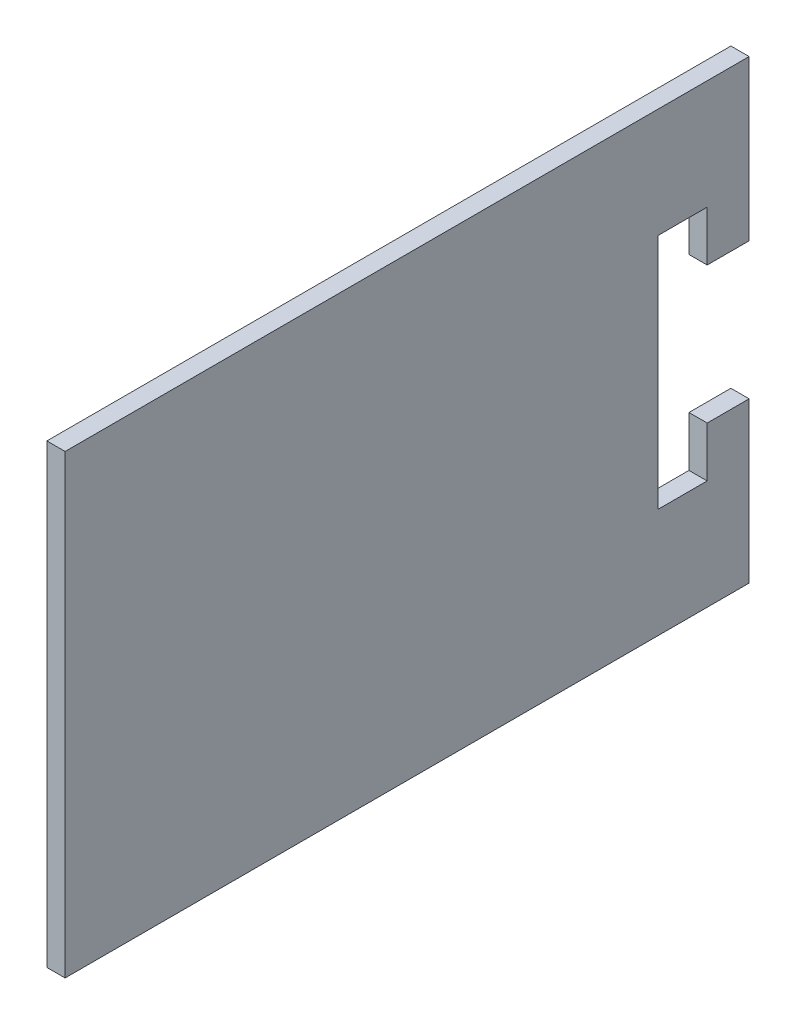
ISO-10303-21;
HEADER;
FILE_DESCRIPTION(('STEP AP214'),'2;1');
FILE_NAME('part.step','',(''),(''),'','','');
FILE_SCHEMA(('AUTOMOTIVE_DESIGN { 1 0 10303 214 1 1 1 1 }'));
ENDSEC;
DATA;
#1=APPLICATION_CONTEXT('core data for automotive mechanical design processes');
#2=APPLICATION_PROTOCOL_DEFINITION('international standard','automotive_design',2000,#1);
#3=PRODUCT_CONTEXT('',#1,'mechanical');
#4=PRODUCT('Part','Part','',(#3));
#5=PRODUCT_RELATED_PRODUCT_CATEGORY('part','',(#4));
#6=PRODUCT_DEFINITION_FORMATION('','',#4);
#7=PRODUCT_DEFINITION_CONTEXT('part definition',#1,'design');
#8=PRODUCT_DEFINITION('design','',#6,#7);
#9=PRODUCT_DEFINITION_SHAPE('','',#8);
#10=(LENGTH_UNIT() NAMED_UNIT(*) SI_UNIT(.MILLI.,.METRE.));
#11=(NAMED_UNIT(*) PLANE_ANGLE_UNIT() SI_UNIT($,.RADIAN.));
#12=(NAMED_UNIT(*) SI_UNIT($,.STERADIAN.) SOLID_ANGLE_UNIT());
#13=UNCERTAINTY_MEASURE_WITH_UNIT(LENGTH_MEASURE(1.E-05),#10,'distance_accuracy_value','');
#14=(GEOMETRIC_REPRESENTATION_CONTEXT(3) GLOBAL_UNCERTAINTY_ASSIGNED_CONTEXT((#13)) GLOBAL_UNIT_ASSIGNED_CONTEXT((#10,
#11,#12)) REPRESENTATION_CONTEXT('',''));
#15=CARTESIAN_POINT('',(0.,0.,0.));
#16=DIRECTION('',(0.,0.,1.));
#17=DIRECTION('',(1.,0.,0.));
#18=AXIS2_PLACEMENT_3D('',#15,#16,#17);
#19=CARTESIAN_POINT('',(2.54,0.,0.));
#20=DIRECTION('',(0.,0.,1.));
#21=DIRECTION('',(1.,0.,0.));
#22=AXIS2_PLACEMENT_3D('',#19,#20,#21);
#23=PLANE('',#22);
#24=DIRECTION('',(0.,1.,0.));
#25=VECTOR('',#24,1.);
#26=CARTESIAN_POINT('',(0.,0.,0.));
#27=LINE('',#26,#25);
#28=CARTESIAN_POINT('',(0.,0.,0.));
#29=VERTEX_POINT('',#28);
#30=CARTESIAN_POINT('',(0.,22.225,0.));
#31=VERTEX_POINT('',#30);
#32=EDGE_CURVE('E344',#29,#31,#27,.T.);
#33=ORIENTED_EDGE('',*,*,#32,.T.);
#34=DIRECTION('',(1.,0.,0.));
#35=VECTOR('',#34,1.);
#36=CARTESIAN_POINT('',(-11.43,22.225,0.));
#37=LINE('',#36,#35);
#38=CARTESIAN_POINT('',(2.54,22.225,0.));
#39=VERTEX_POINT('',#38);
#40=EDGE_CURVE('E297',#31,#39,#37,.T.);
#41=ORIENTED_EDGE('',*,*,#40,.T.);
#42=DIRECTION('',(0.,1.,0.));
#43=VECTOR('',#42,1.);
#44=CARTESIAN_POINT('',(2.54,0.,0.));
#45=LINE('',#44,#43);
#46=CARTESIAN_POINT('',(2.54,0.,0.));
#47=VERTEX_POINT('',#46);
#48=EDGE_CURVE('E329',#47,#39,#45,.T.);
#49=ORIENTED_EDGE('',*,*,#48,.F.);
#50=DIRECTION('',(-1.,0.,0.));
#51=VECTOR('',#50,1.);
#52=CARTESIAN_POINT('',(2.54,0.,0.));
#53=LINE('',#52,#51);
#54=EDGE_CURVE('E364',#47,#29,#53,.T.);
#55=ORIENTED_EDGE('',*,*,#54,.T.);
#56=EDGE_LOOP('',(#33,#41,#49,#55));
#57=FACE_BOUND('',#56,.T.);
#58=ADVANCED_FACE('F45',(#57),#23,.F.);
#59=CARTESIAN_POINT('',(2.54,0.,0.));
#60=DIRECTION('',(0.,1.,0.));
#61=DIRECTION('',(0.,0.,1.));
#62=AXIS2_PLACEMENT_3D('',#59,#60,#61);
#63=PLANE('',#62);
#64=DIRECTION('',(0.,0.,-1.));
#65=VECTOR('',#64,1.);
#66=CARTESIAN_POINT('',(0.,0.,0.));
#67=LINE('',#66,#65);
#68=CARTESIAN_POINT('',(0.,0.,95.25));
#69=VERTEX_POINT('',#68);
#70=EDGE_CURVE('E301',#69,#29,#67,.T.);
#71=ORIENTED_EDGE('',*,*,#70,.T.);
#72=ORIENTED_EDGE('',*,*,#54,.F.);
#73=DIRECTION('',(0.,0.,-1.));
#74=VECTOR('',#73,1.);
#75=CARTESIAN_POINT('',(2.54,0.,0.));
#76=LINE('',#75,#74);
#77=CARTESIAN_POINT('',(2.54,0.,95.25));
#78=VERTEX_POINT('',#77);
#79=EDGE_CURVE('E323',#78,#47,#76,.T.);
#80=ORIENTED_EDGE('',*,*,#79,.F.);
#81=DIRECTION('',(-1.,0.,0.));
#82=VECTOR('',#81,1.);
#83=CARTESIAN_POINT('',(2.54,0.,95.25));
#84=LINE('',#83,#82);
#85=EDGE_CURVE('E339',#78,#69,#84,.T.);
#86=ORIENTED_EDGE('',*,*,#85,.T.);
#87=EDGE_LOOP('',(#71,#72,#80,#86));
#88=FACE_BOUND('',#87,.T.);
#89=ADVANCED_FACE('F47',(#88),#63,.F.);
#90=CARTESIAN_POINT('',(2.54,41.275,0.));
#91=VERTEX_POINT('',#90);
#92=CARTESIAN_POINT('',(2.54,63.5,0.));
#93=VERTEX_POINT('',#92);
#94=EDGE_CURVE('E327',#91,#93,#45,.T.);
#95=ORIENTED_EDGE('',*,*,#94,.F.);
#96=DIRECTION('',(1.,0.,0.));
#97=VECTOR('',#96,1.);
#98=CARTESIAN_POINT('',(-11.43,41.275,0.));
#99=LINE('',#98,#97);
#100=CARTESIAN_POINT('',(0.,41.275,0.));
#101=VERTEX_POINT('',#100);
#102=EDGE_CURVE('E317',#101,#91,#99,.T.);
#103=ORIENTED_EDGE('',*,*,#102,.F.);
#104=CARTESIAN_POINT('',(0.,63.5,0.));
#105=VERTEX_POINT('',#104);
#106=EDGE_CURVE('E343',#101,#105,#27,.T.);
#107=ORIENTED_EDGE('',*,*,#106,.T.);
#108=DIRECTION('',(-1.,0.,0.));
#109=VECTOR('',#108,1.);
#110=CARTESIAN_POINT('',(2.54,63.5,0.));
#111=LINE('',#110,#109);
#112=EDGE_CURVE('E360',#93,#105,#111,.T.);
#113=ORIENTED_EDGE('',*,*,#112,.F.);
#114=EDGE_LOOP('',(#95,#103,#107,#113));
#115=FACE_BOUND('',#114,.T.);
#116=ADVANCED_FACE('F428',(#115),#23,.F.);
#117=CARTESIAN_POINT('',(2.54,63.5,0.));
#118=DIRECTION('',(0.,-1.,0.));
#119=DIRECTION('',(0.,0.,-1.));
#120=AXIS2_PLACEMENT_3D('',#117,#118,#119);
#121=PLANE('',#120);
#122=DIRECTION('',(0.,0.,1.));
#123=VECTOR('',#122,1.);
#124=CARTESIAN_POINT('',(0.,63.5,0.));
#125=LINE('',#124,#123);
#126=CARTESIAN_POINT('',(0.,63.5,95.25));
#127=VERTEX_POINT('',#126);
#128=EDGE_CURVE('E348',#105,#127,#125,.T.);
#129=ORIENTED_EDGE('',*,*,#128,.T.);
#130=DIRECTION('',(-1.,0.,0.));
#131=VECTOR('',#130,1.);
#132=CARTESIAN_POINT('',(2.54,63.5,95.25));
#133=LINE('',#132,#131);
#134=CARTESIAN_POINT('',(2.54,63.5,95.25));
#135=VERTEX_POINT('',#134);
#136=EDGE_CURVE('E356',#135,#127,#133,.T.);
#137=ORIENTED_EDGE('',*,*,#136,.F.);
#138=DIRECTION('',(0.,0.,1.));
#139=VECTOR('',#138,1.);
#140=CARTESIAN_POINT('',(2.54,63.5,0.));
#141=LINE('',#140,#139);
#142=EDGE_CURVE('E333',#93,#135,#141,.T.);
#143=ORIENTED_EDGE('',*,*,#142,.F.);
#144=ORIENTED_EDGE('',*,*,#112,.T.);
#145=EDGE_LOOP('',(#129,#137,#143,#144));
#146=FACE_BOUND('',#145,.T.);
#147=ADVANCED_FACE('F436',(#146),#121,.F.);
#148=CARTESIAN_POINT('',(2.54,0.,95.25));
#149=DIRECTION('',(0.,0.,-1.));
#150=DIRECTION('',(-1.,0.,0.));
#151=AXIS2_PLACEMENT_3D('',#148,#149,#150);
#152=PLANE('',#151);
#153=DIRECTION('',(0.,-1.,0.));
#154=VECTOR('',#153,1.);
#155=CARTESIAN_POINT('',(0.,0.,95.25));
#156=LINE('',#155,#154);
#157=EDGE_CURVE('E328',#127,#69,#156,.T.);
#158=ORIENTED_EDGE('',*,*,#157,.T.);
#159=ORIENTED_EDGE('',*,*,#85,.F.);
#160=DIRECTION('',(0.,-1.,0.));
#161=VECTOR('',#160,1.);
#162=CARTESIAN_POINT('',(2.54,0.,95.25));
#163=LINE('',#162,#161);
#164=EDGE_CURVE('E336',#135,#78,#163,.T.);
#165=ORIENTED_EDGE('',*,*,#164,.F.);
#166=ORIENTED_EDGE('',*,*,#136,.T.);
#167=EDGE_LOOP('',(#158,#159,#165,#166));
#168=FACE_BOUND('',#167,.T.);
#169=ADVANCED_FACE('F442',(#168),#152,.F.);
#170=CARTESIAN_POINT('',(2.54,0.,0.));
#171=DIRECTION('',(-1.,0.,0.));
#172=DIRECTION('',(0.,0.,1.));
#173=AXIS2_PLACEMENT_3D('',#170,#171,#172);
#174=PLANE('',#173);
#175=ORIENTED_EDGE('',*,*,#48,.T.);
#176=DIRECTION('',(0.,0.,-1.));
#177=VECTOR('',#176,1.);
#178=CARTESIAN_POINT('',(2.54,22.225,0.));
#179=LINE('',#178,#177);
#180=CARTESIAN_POINT('',(2.54,22.225,5.842));
#181=VERTEX_POINT('',#180);
#182=EDGE_CURVE('E270',#181,#39,#179,.T.);
#183=ORIENTED_EDGE('',*,*,#182,.F.);
#184=DIRECTION('',(0.,1.,0.));
#185=VECTOR('',#184,1.);
#186=CARTESIAN_POINT('',(2.54,22.225,5.842));
#187=LINE('',#186,#185);
#188=CARTESIAN_POINT('',(2.54,15.24,5.842));
#189=VERTEX_POINT('',#188);
#190=EDGE_CURVE('E293',#189,#181,#187,.T.);
#191=ORIENTED_EDGE('',*,*,#190,.F.);
#192=DIRECTION('',(0.,0.,-1.));
#193=VECTOR('',#192,1.);
#194=CARTESIAN_POINT('',(2.54,15.24,12.7));
#195=LINE('',#194,#193);
#196=CARTESIAN_POINT('',(2.54,15.24,12.7));
#197=VERTEX_POINT('',#196);
#198=EDGE_CURVE('E289',#197,#189,#195,.T.);
#199=ORIENTED_EDGE('',*,*,#198,.F.);
#200=DIRECTION('',(0.,-1.,0.));
#201=VECTOR('',#200,1.);
#202=CARTESIAN_POINT('',(2.54,22.098,12.7));
#203=LINE('',#202,#201);
#204=CARTESIAN_POINT('',(2.54,48.26,12.7));
#205=VERTEX_POINT('',#204);
#206=EDGE_CURVE('E285',#205,#197,#203,.T.);
#207=ORIENTED_EDGE('',*,*,#206,.F.);
#208=DIRECTION('',(0.,0.,1.));
#209=VECTOR('',#208,1.);
#210=CARTESIAN_POINT('',(2.54,48.26,12.7));
#211=LINE('',#210,#209);
#212=CARTESIAN_POINT('',(2.54,48.26,5.842));
#213=VERTEX_POINT('',#212);
#214=EDGE_CURVE('E281',#213,#205,#211,.T.);
#215=ORIENTED_EDGE('',*,*,#214,.F.);
#216=DIRECTION('',(0.,1.,0.));
#217=VECTOR('',#216,1.);
#218=CARTESIAN_POINT('',(2.54,41.275,5.842));
#219=LINE('',#218,#217);
#220=CARTESIAN_POINT('',(2.54,41.275,5.842));
#221=VERTEX_POINT('',#220);
#222=EDGE_CURVE('E277',#221,#213,#219,.T.);
#223=ORIENTED_EDGE('',*,*,#222,.F.);
#224=DIRECTION('',(0.,0.,1.));
#225=VECTOR('',#224,1.);
#226=CARTESIAN_POINT('',(2.54,41.275,0.));
#227=LINE('',#226,#225);
#228=EDGE_CURVE('E273',#91,#221,#227,.T.);
#229=ORIENTED_EDGE('',*,*,#228,.F.);
#230=ORIENTED_EDGE('',*,*,#94,.T.);
#231=ORIENTED_EDGE('',*,*,#142,.T.);
#232=ORIENTED_EDGE('',*,*,#164,.T.);
#233=ORIENTED_EDGE('',*,*,#79,.T.);
#234=EDGE_LOOP('',(#175,#183,#191,#199,#207,#215,#223,#229,#230,#231,#232,#233));
#235=FACE_BOUND('',#234,.T.);
#236=ADVANCED_FACE('F463',(#235),#174,.F.);
#237=CARTESIAN_POINT('',(0.,0.,0.));
#238=DIRECTION('',(-1.,0.,0.));
#239=DIRECTION('',(0.,0.,1.));
#240=AXIS2_PLACEMENT_3D('',#237,#238,#239);
#241=PLANE('',#240);
#242=DIRECTION('',(0.,0.,-1.));
#243=VECTOR('',#242,1.);
#244=CARTESIAN_POINT('',(0.,40.64,12.7));
#245=LINE('',#244,#243);
#246=CARTESIAN_POINT('',(0.,40.64,27.94));
#247=VERTEX_POINT('',#246);
#248=CARTESIAN_POINT('',(0.,40.64,12.7));
#249=VERTEX_POINT('',#248);
#250=EDGE_CURVE('E69',#247,#249,#245,.T.);
#251=ORIENTED_EDGE('',*,*,#250,.F.);
#252=DIRECTION('',(0.,1.,0.));
#253=VECTOR('',#252,1.);
#254=CARTESIAN_POINT('',(0.,40.64,27.94));
#255=LINE('',#254,#253);
#256=CARTESIAN_POINT('',(0.,25.4,27.94));
#257=VERTEX_POINT('',#256);
#258=EDGE_CURVE('E237',#257,#247,#255,.T.);
#259=ORIENTED_EDGE('',*,*,#258,.F.);
#260=DIRECTION('',(0.,0.,1.));
#261=VECTOR('',#260,1.);
#262=CARTESIAN_POINT('',(0.,25.4,12.7));
#263=LINE('',#262,#261);
#264=CARTESIAN_POINT('',(0.,25.4,12.7));
#265=VERTEX_POINT('',#264);
#266=EDGE_CURVE('E249',#265,#257,#263,.T.);
#267=ORIENTED_EDGE('',*,*,#266,.F.);
#268=DIRECTION('',(0.,1.,0.));
#269=VECTOR('',#268,1.);
#270=CARTESIAN_POINT('',(0.,0.,12.7));
#271=LINE('',#270,#269);
#272=CARTESIAN_POINT('',(0.,15.24,12.7));
#273=VERTEX_POINT('',#272);
#274=EDGE_CURVE('E379',#273,#265,#271,.T.);
#275=ORIENTED_EDGE('',*,*,#274,.F.);
#276=DIRECTION('',(0.,0.,1.));
#277=VECTOR('',#276,1.);
#278=CARTESIAN_POINT('',(0.,15.24,0.));
#279=LINE('',#278,#277);
#280=CARTESIAN_POINT('',(0.,15.24,5.842));
#281=VERTEX_POINT('',#280);
#282=EDGE_CURVE('E383',#281,#273,#279,.T.);
#283=ORIENTED_EDGE('',*,*,#282,.F.);
#284=DIRECTION('',(0.,-1.,0.));
#285=VECTOR('',#284,1.);
#286=CARTESIAN_POINT('',(0.,0.,5.842));
#287=LINE('',#286,#285);
#288=CARTESIAN_POINT('',(0.,22.225,5.842));
#289=VERTEX_POINT('',#288);
#290=EDGE_CURVE('E54',#289,#281,#287,.T.);
#291=ORIENTED_EDGE('',*,*,#290,.F.);
#292=DIRECTION('',(0.,0.,1.));
#293=VECTOR('',#292,1.);
#294=CARTESIAN_POINT('',(0.,22.225,0.));
#295=LINE('',#294,#293);
#296=EDGE_CURVE('E11',#31,#289,#295,.T.);
#297=ORIENTED_EDGE('',*,*,#296,.F.);
#298=ORIENTED_EDGE('',*,*,#32,.F.);
#299=ORIENTED_EDGE('',*,*,#70,.F.);
#300=ORIENTED_EDGE('',*,*,#157,.F.);
#301=ORIENTED_EDGE('',*,*,#128,.F.);
#302=ORIENTED_EDGE('',*,*,#106,.F.);
#303=DIRECTION('',(0.,0.,-1.));
#304=VECTOR('',#303,1.);
#305=CARTESIAN_POINT('',(0.,41.275,0.));
#306=LINE('',#305,#304);
#307=CARTESIAN_POINT('',(0.,41.275,5.842));
#308=VERTEX_POINT('',#307);
#309=EDGE_CURVE('E368',#308,#101,#306,.T.);
#310=ORIENTED_EDGE('',*,*,#309,.F.);
#311=DIRECTION('',(0.,-1.,0.));
#312=VECTOR('',#311,1.);
#313=CARTESIAN_POINT('',(0.,0.,5.84199999999998));
#314=LINE('',#313,#312);
#315=CARTESIAN_POINT('',(0.,48.26,5.842));
#316=VERTEX_POINT('',#315);
#317=EDGE_CURVE('E371',#316,#308,#314,.T.);
#318=ORIENTED_EDGE('',*,*,#317,.F.);
#319=DIRECTION('',(0.,0.,-1.));
#320=VECTOR('',#319,1.);
#321=CARTESIAN_POINT('',(0.,48.26,0.));
#322=LINE('',#321,#320);
#323=CARTESIAN_POINT('',(0.,48.26,12.7));
#324=VERTEX_POINT('',#323);
#325=EDGE_CURVE('E375',#324,#316,#322,.T.);
#326=ORIENTED_EDGE('',*,*,#325,.F.);
#327=EDGE_CURVE('E378',#249,#324,#271,.T.);
#328=ORIENTED_EDGE('',*,*,#327,.F.);
#329=EDGE_LOOP('',(#251,#259,#267,#275,#283,#291,#297,#298,#299,#300,#301,#302,#310,#318,#326,#328));
#330=FACE_BOUND('',#329,.T.);
#331=ADVANCED_FACE('F399',(#330),#241,.T.);
#332=CARTESIAN_POINT('',(-11.43,22.225,0.));
#333=DIRECTION('',(0.,-1.,0.));
#334=DIRECTION('',(0.,0.,-1.));
#335=AXIS2_PLACEMENT_3D('',#332,#333,#334);
#336=PLANE('',#335);
#337=ORIENTED_EDGE('',*,*,#296,.T.);
#338=DIRECTION('',(1.,0.,0.));
#339=VECTOR('',#338,1.);
#340=CARTESIAN_POINT('',(-11.43,22.225,5.842));
#341=LINE('',#340,#339);
#342=EDGE_CURVE('E298',#289,#181,#341,.T.);
#343=ORIENTED_EDGE('',*,*,#342,.T.);
#344=ORIENTED_EDGE('',*,*,#182,.T.);
#345=ORIENTED_EDGE('',*,*,#40,.F.);
#346=EDGE_LOOP('',(#337,#343,#344,#345));
#347=FACE_BOUND('',#346,.T.);
#348=ADVANCED_FACE('F466',(#347),#336,.F.);
#349=CARTESIAN_POINT('',(-11.43,22.225,5.842));
#350=DIRECTION('',(0.,0.,-1.));
#351=DIRECTION('',(0.,1.,0.));
#352=AXIS2_PLACEMENT_3D('',#349,#350,#351);
#353=PLANE('',#352);
#354=ORIENTED_EDGE('',*,*,#290,.T.);
#355=DIRECTION('',(1.,0.,0.));
#356=VECTOR('',#355,1.);
#357=CARTESIAN_POINT('',(-11.43,15.24,5.842));
#358=LINE('',#357,#356);
#359=EDGE_CURVE('E302',#281,#189,#358,.T.);
#360=ORIENTED_EDGE('',*,*,#359,.T.);
#361=ORIENTED_EDGE('',*,*,#190,.T.);
#362=ORIENTED_EDGE('',*,*,#342,.F.);
#363=EDGE_LOOP('',(#354,#360,#361,#362));
#364=FACE_BOUND('',#363,.T.);
#365=ADVANCED_FACE('F390',(#364),#353,.F.);
#366=CARTESIAN_POINT('',(-11.43,15.24,12.7));
#367=DIRECTION('',(0.,-1.,0.));
#368=DIRECTION('',(0.,0.,-1.));
#369=AXIS2_PLACEMENT_3D('',#366,#367,#368);
#370=PLANE('',#369);
#371=ORIENTED_EDGE('',*,*,#282,.T.);
#372=DIRECTION('',(1.,0.,0.));
#373=VECTOR('',#372,1.);
#374=CARTESIAN_POINT('',(-11.43,15.24,12.7));
#375=LINE('',#374,#373);
#376=EDGE_CURVE('E305',#273,#197,#375,.T.);
#377=ORIENTED_EDGE('',*,*,#376,.T.);
#378=ORIENTED_EDGE('',*,*,#198,.T.);
#379=ORIENTED_EDGE('',*,*,#359,.F.);
#380=EDGE_LOOP('',(#371,#377,#378,#379));
#381=FACE_BOUND('',#380,.T.);
#382=ADVANCED_FACE('F394',(#381),#370,.F.);
#383=CARTESIAN_POINT('',(-11.43,22.098,12.7));
#384=DIRECTION('',(0.,0.,1.));
#385=DIRECTION('',(0.,-1.,0.));
#386=AXIS2_PLACEMENT_3D('',#383,#384,#385);
#387=PLANE('',#386);
#388=DIRECTION('',(1.,0.,0.));
#389=VECTOR('',#388,1.);
#390=CARTESIAN_POINT('',(-12.7,38.1,12.7));
#391=LINE('',#390,#389);
#392=CARTESIAN_POINT('',(-12.7,38.1,12.7));
#393=VERTEX_POINT('',#392);
#394=CARTESIAN_POINT('',(0.,38.1,12.7));
#395=VERTEX_POINT('',#394);
#396=EDGE_CURVE('E218',#393,#395,#391,.T.);
#397=ORIENTED_EDGE('',*,*,#396,.F.);
#398=DIRECTION('',(0.,1.,0.));
#399=VECTOR('',#398,1.);
#400=CARTESIAN_POINT('',(-12.7,38.1,12.7));
#401=LINE('',#400,#399);
#402=CARTESIAN_POINT('',(-12.7,27.94,12.7));
#403=VERTEX_POINT('',#402);
#404=EDGE_CURVE('E61',#403,#393,#401,.T.);
#405=ORIENTED_EDGE('',*,*,#404,.F.);
#406=DIRECTION('',(-1.,0.,0.));
#407=VECTOR('',#406,1.);
#408=CARTESIAN_POINT('',(-12.7,27.94,12.7));
#409=LINE('',#408,#407);
#410=CARTESIAN_POINT('',(0.,27.94,12.7));
#411=VERTEX_POINT('',#410);
#412=EDGE_CURVE('E205',#411,#403,#409,.T.);
#413=ORIENTED_EDGE('',*,*,#412,.F.);
#414=DIRECTION('',(0.,-1.,0.));
#415=VECTOR('',#414,1.);
#416=CARTESIAN_POINT('',(0.,38.1,12.7));
#417=LINE('',#416,#415);
#418=EDGE_CURVE('E209',#395,#411,#417,.T.);
#419=ORIENTED_EDGE('',*,*,#418,.F.);
#420=EDGE_LOOP('',(#397,#405,#413,#419));
#421=FACE_BOUND('',#420,.T.);
#422=ORIENTED_EDGE('',*,*,#274,.T.);
#423=DIRECTION('',(1.,0.,0.));
#424=VECTOR('',#423,1.);
#425=CARTESIAN_POINT('',(-15.24,25.4,12.7));
#426=LINE('',#425,#424);
#427=CARTESIAN_POINT('',(-15.24,25.4,12.7));
#428=VERTEX_POINT('',#427);
#429=EDGE_CURVE('E262',#428,#265,#426,.T.);
#430=ORIENTED_EDGE('',*,*,#429,.F.);
#431=DIRECTION('',(0.,-1.,0.));
#432=VECTOR('',#431,1.);
#433=CARTESIAN_POINT('',(-15.24,40.64,12.7));
#434=LINE('',#433,#432);
#435=CARTESIAN_POINT('',(-15.24,40.64,12.7));
#436=VERTEX_POINT('',#435);
#437=EDGE_CURVE('E236',#436,#428,#434,.T.);
#438=ORIENTED_EDGE('',*,*,#437,.F.);
#439=DIRECTION('',(1.,0.,0.));
#440=VECTOR('',#439,1.);
#441=CARTESIAN_POINT('',(-15.24,40.64,12.7));
#442=LINE('',#441,#440);
#443=EDGE_CURVE('E266',#436,#249,#442,.T.);
#444=ORIENTED_EDGE('',*,*,#443,.T.);
#445=ORIENTED_EDGE('',*,*,#327,.T.);
#446=DIRECTION('',(1.,0.,0.));
#447=VECTOR('',#446,1.);
#448=CARTESIAN_POINT('',(-11.43,48.26,12.7));
#449=LINE('',#448,#447);
#450=EDGE_CURVE('E308',#324,#205,#449,.T.);
#451=ORIENTED_EDGE('',*,*,#450,.T.);
#452=ORIENTED_EDGE('',*,*,#206,.T.);
#453=ORIENTED_EDGE('',*,*,#376,.F.);
#454=EDGE_LOOP('',(#422,#430,#438,#444,#445,#451,#452,#453));
#455=FACE_BOUND('',#454,.T.);
#456=ADVANCED_FACE('F402',(#421,#455),#387,.F.);
#457=CARTESIAN_POINT('',(-11.43,48.26,12.7));
#458=DIRECTION('',(0.,1.,0.));
#459=DIRECTION('',(0.,0.,1.));
#460=AXIS2_PLACEMENT_3D('',#457,#458,#459);
#461=PLANE('',#460);
#462=ORIENTED_EDGE('',*,*,#325,.T.);
#463=DIRECTION('',(1.,0.,0.));
#464=VECTOR('',#463,1.);
#465=CARTESIAN_POINT('',(-11.43,48.26,5.842));
#466=LINE('',#465,#464);
#467=EDGE_CURVE('E311',#316,#213,#466,.T.);
#468=ORIENTED_EDGE('',*,*,#467,.T.);
#469=ORIENTED_EDGE('',*,*,#214,.T.);
#470=ORIENTED_EDGE('',*,*,#450,.F.);
#471=EDGE_LOOP('',(#462,#468,#469,#470));
#472=FACE_BOUND('',#471,.T.);
#473=ADVANCED_FACE('F472',(#472),#461,.F.);
#474=CARTESIAN_POINT('',(-11.43,41.275,5.842));
#475=DIRECTION('',(0.,0.,-1.));
#476=DIRECTION('',(0.,1.,0.));
#477=AXIS2_PLACEMENT_3D('',#474,#475,#476);
#478=PLANE('',#477);
#479=ORIENTED_EDGE('',*,*,#317,.T.);
#480=DIRECTION('',(1.,0.,0.));
#481=VECTOR('',#480,1.);
#482=CARTESIAN_POINT('',(-11.43,41.275,5.842));
#483=LINE('',#482,#481);
#484=EDGE_CURVE('E314',#308,#221,#483,.T.);
#485=ORIENTED_EDGE('',*,*,#484,.T.);
#486=ORIENTED_EDGE('',*,*,#222,.T.);
#487=ORIENTED_EDGE('',*,*,#467,.F.);
#488=EDGE_LOOP('',(#479,#485,#486,#487));
#489=FACE_BOUND('',#488,.T.);
#490=ADVANCED_FACE('F476',(#489),#478,.F.);
#491=CARTESIAN_POINT('',(-11.43,41.275,0.));
#492=DIRECTION('',(0.,1.,0.));
#493=DIRECTION('',(0.,0.,1.));
#494=AXIS2_PLACEMENT_3D('',#491,#492,#493);
#495=PLANE('',#494);
#496=ORIENTED_EDGE('',*,*,#309,.T.);
#497=ORIENTED_EDGE('',*,*,#102,.T.);
#498=ORIENTED_EDGE('',*,*,#228,.T.);
#499=ORIENTED_EDGE('',*,*,#484,.F.);
#500=EDGE_LOOP('',(#496,#497,#498,#499));
#501=FACE_BOUND('',#500,.T.);
#502=ADVANCED_FACE('F478',(#501),#495,.F.);
#503=CARTESIAN_POINT('',(-15.24,40.64,12.7));
#504=DIRECTION('',(0.,-1.,0.));
#505=DIRECTION('',(0.,0.,-1.));
#506=AXIS2_PLACEMENT_3D('',#503,#504,#505);
#507=PLANE('',#506);
#508=ORIENTED_EDGE('',*,*,#250,.T.);
#509=ORIENTED_EDGE('',*,*,#443,.F.);
#510=DIRECTION('',(0.,0.,-1.));
#511=VECTOR('',#510,1.);
#512=CARTESIAN_POINT('',(-15.24,40.64,12.7));
#513=LINE('',#512,#511);
#514=CARTESIAN_POINT('',(-15.24,40.64,27.94));
#515=VERTEX_POINT('',#514);
#516=EDGE_CURVE('E232',#515,#436,#513,.T.);
#517=ORIENTED_EDGE('',*,*,#516,.F.);
#518=DIRECTION('',(1.,0.,0.));
#519=VECTOR('',#518,1.);
#520=CARTESIAN_POINT('',(-15.24,40.64,27.94));
#521=LINE('',#520,#519);
#522=EDGE_CURVE('E246',#515,#247,#521,.T.);
#523=ORIENTED_EDGE('',*,*,#522,.T.);
#524=EDGE_LOOP('',(#508,#509,#517,#523));
#525=FACE_BOUND('',#524,.T.);
#526=ADVANCED_FACE('F415',(#525),#507,.F.);
#527=CARTESIAN_POINT('',(-15.24,25.4,12.7));
#528=DIRECTION('',(0.,1.,0.));
#529=DIRECTION('',(0.,0.,1.));
#530=AXIS2_PLACEMENT_3D('',#527,#528,#529);
#531=PLANE('',#530);
#532=ORIENTED_EDGE('',*,*,#266,.T.);
#533=DIRECTION('',(1.,0.,0.));
#534=VECTOR('',#533,1.);
#535=CARTESIAN_POINT('',(-15.24,25.4,27.94));
#536=LINE('',#535,#534);
#537=CARTESIAN_POINT('',(-15.24,25.4,27.94));
#538=VERTEX_POINT('',#537);
#539=EDGE_CURVE('E258',#538,#257,#536,.T.);
#540=ORIENTED_EDGE('',*,*,#539,.F.);
#541=DIRECTION('',(0.,0.,1.));
#542=VECTOR('',#541,1.);
#543=CARTESIAN_POINT('',(-15.24,25.4,12.7));
#544=LINE('',#543,#542);
#545=EDGE_CURVE('E240',#428,#538,#544,.T.);
#546=ORIENTED_EDGE('',*,*,#545,.F.);
#547=ORIENTED_EDGE('',*,*,#429,.T.);
#548=EDGE_LOOP('',(#532,#540,#546,#547));
#549=FACE_BOUND('',#548,.T.);
#550=ADVANCED_FACE('F405',(#549),#531,.F.);
#551=CARTESIAN_POINT('',(-15.24,40.64,27.94));
#552=DIRECTION('',(0.,0.,-1.));
#553=DIRECTION('',(-1.,0.,0.));
#554=AXIS2_PLACEMENT_3D('',#551,#552,#553);
#555=PLANE('',#554);
#556=ORIENTED_EDGE('',*,*,#258,.T.);
#557=ORIENTED_EDGE('',*,*,#522,.F.);
#558=DIRECTION('',(0.,1.,0.));
#559=VECTOR('',#558,1.);
#560=CARTESIAN_POINT('',(-15.24,40.64,27.94));
#561=LINE('',#560,#559);
#562=EDGE_CURVE('E243',#538,#515,#561,.T.);
#563=ORIENTED_EDGE('',*,*,#562,.F.);
#564=ORIENTED_EDGE('',*,*,#539,.T.);
#565=EDGE_LOOP('',(#556,#557,#563,#564));
#566=FACE_BOUND('',#565,.T.);
#567=ADVANCED_FACE('F417',(#566),#555,.F.);
#568=CARTESIAN_POINT('',(-15.24,0.,0.));
#569=DIRECTION('',(1.,0.,0.));
#570=DIRECTION('',(0.,0.,-1.));
#571=AXIS2_PLACEMENT_3D('',#568,#569,#570);
#572=PLANE('',#571);
#573=ORIENTED_EDGE('',*,*,#516,.T.);
#574=ORIENTED_EDGE('',*,*,#437,.T.);
#575=ORIENTED_EDGE('',*,*,#545,.T.);
#576=ORIENTED_EDGE('',*,*,#562,.T.);
#577=EDGE_LOOP('',(#573,#574,#575,#576));
#578=FACE_BOUND('',#577,.T.);
#579=ADVANCED_FACE('F409',(#578),#572,.F.);
#580=CARTESIAN_POINT('',(-12.7,38.1,25.4));
#581=DIRECTION('',(-1.,0.,0.));
#582=DIRECTION('',(0.,0.,1.));
#583=AXIS2_PLACEMENT_3D('',#580,#581,#582);
#584=PLANE('',#583);
#585=ORIENTED_EDGE('',*,*,#404,.T.);
#586=DIRECTION('',(0.,0.,-1.));
#587=VECTOR('',#586,1.);
#588=CARTESIAN_POINT('',(-12.7,38.1,25.4));
#589=LINE('',#588,#587);
#590=CARTESIAN_POINT('',(-12.7,38.1,25.4));
#591=VERTEX_POINT('',#590);
#592=EDGE_CURVE('E180',#591,#393,#589,.T.);
#593=ORIENTED_EDGE('',*,*,#592,.F.);
#594=DIRECTION('',(0.,1.,0.));
#595=VECTOR('',#594,1.);
#596=CARTESIAN_POINT('',(-12.7,38.1,25.4));
#597=LINE('',#596,#595);
#598=CARTESIAN_POINT('',(-12.7,27.94,25.4));
#599=VERTEX_POINT('',#598);
#600=EDGE_CURVE('E184',#599,#591,#597,.T.);
#601=ORIENTED_EDGE('',*,*,#600,.F.);
#602=DIRECTION('',(0.,0.,-1.));
#603=VECTOR('',#602,1.);
#604=CARTESIAN_POINT('',(-12.7,27.94,25.4));
#605=LINE('',#604,#603);
#606=EDGE_CURVE('E224',#599,#403,#605,.T.);
#607=ORIENTED_EDGE('',*,*,#606,.T.);
#608=EDGE_LOOP('',(#585,#593,#601,#607));
#609=FACE_BOUND('',#608,.T.);
#610=ADVANCED_FACE('F182',(#609),#584,.F.);
#611=CARTESIAN_POINT('',(-12.7,27.94,25.4));
#612=DIRECTION('',(0.,-1.,0.));
#613=DIRECTION('',(0.,0.,-1.));
#614=AXIS2_PLACEMENT_3D('',#611,#612,#613);
#615=PLANE('',#614);
#616=ORIENTED_EDGE('',*,*,#412,.T.);
#617=ORIENTED_EDGE('',*,*,#606,.F.);
#618=DIRECTION('',(-1.,0.,0.));
#619=VECTOR('',#618,1.);
#620=CARTESIAN_POINT('',(-12.7,27.94,25.4));
#621=LINE('',#620,#619);
#622=CARTESIAN_POINT('',(0.,27.94,25.4));
#623=VERTEX_POINT('',#622);
#624=EDGE_CURVE('E191',#623,#599,#621,.T.);
#625=ORIENTED_EDGE('',*,*,#624,.F.);
#626=DIRECTION('',(0.,0.,-1.));
#627=VECTOR('',#626,1.);
#628=CARTESIAN_POINT('',(0.,27.94,25.4));
#629=LINE('',#628,#627);
#630=EDGE_CURVE('E227',#623,#411,#629,.T.);
#631=ORIENTED_EDGE('',*,*,#630,.T.);
#632=EDGE_LOOP('',(#616,#617,#625,#631));
#633=FACE_BOUND('',#632,.T.);
#634=ADVANCED_FACE('F600',(#633),#615,.F.);
#635=CARTESIAN_POINT('',(0.,38.1,25.4));
#636=DIRECTION('',(1.,0.,0.));
#637=DIRECTION('',(0.,0.,-1.));
#638=AXIS2_PLACEMENT_3D('',#635,#636,#637);
#639=PLANE('',#638);
#640=ORIENTED_EDGE('',*,*,#418,.T.);
#641=ORIENTED_EDGE('',*,*,#630,.F.);
#642=DIRECTION('',(0.,-1.,0.));
#643=VECTOR('',#642,1.);
#644=CARTESIAN_POINT('',(0.,38.1,25.4));
#645=LINE('',#644,#643);
#646=CARTESIAN_POINT('',(0.,38.1,25.4));
#647=VERTEX_POINT('',#646);
#648=EDGE_CURVE('E200',#647,#623,#645,.T.);
#649=ORIENTED_EDGE('',*,*,#648,.F.);
#650=DIRECTION('',(0.,0.,-1.));
#651=VECTOR('',#650,1.);
#652=CARTESIAN_POINT('',(0.,38.1,25.4));
#653=LINE('',#652,#651);
#654=EDGE_CURVE('E190',#647,#395,#653,.T.);
#655=ORIENTED_EDGE('',*,*,#654,.T.);
#656=EDGE_LOOP('',(#640,#641,#649,#655));
#657=FACE_BOUND('',#656,.T.);
#658=ADVANCED_FACE('F608',(#657),#639,.F.);
#659=CARTESIAN_POINT('',(-12.7,38.1,25.4));
#660=DIRECTION('',(0.,1.,0.));
#661=DIRECTION('',(0.,0.,1.));
#662=AXIS2_PLACEMENT_3D('',#659,#660,#661);
#663=PLANE('',#662);
#664=ORIENTED_EDGE('',*,*,#396,.T.);
#665=ORIENTED_EDGE('',*,*,#654,.F.);
#666=DIRECTION('',(1.,0.,0.));
#667=VECTOR('',#666,1.);
#668=CARTESIAN_POINT('',(-12.7,38.1,25.4));
#669=LINE('',#668,#667);
#670=EDGE_CURVE('E194',#591,#647,#669,.T.);
#671=ORIENTED_EDGE('',*,*,#670,.F.);
#672=ORIENTED_EDGE('',*,*,#592,.T.);
#673=EDGE_LOOP('',(#664,#665,#671,#672));
#674=FACE_BOUND('',#673,.T.);
#675=ADVANCED_FACE('F195',(#674),#663,.F.);
#676=CARTESIAN_POINT('',(0.,0.,25.4));
#677=DIRECTION('',(0.,0.,1.));
#678=DIRECTION('',(1.,0.,0.));
#679=AXIS2_PLACEMENT_3D('',#676,#677,#678);
#680=PLANE('',#679);
#681=ORIENTED_EDGE('',*,*,#600,.T.);
#682=ORIENTED_EDGE('',*,*,#670,.T.);
#683=ORIENTED_EDGE('',*,*,#648,.T.);
#684=ORIENTED_EDGE('',*,*,#624,.T.);
#685=EDGE_LOOP('',(#681,#682,#683,#684));
#686=FACE_BOUND('',#685,.T.);
#687=ADVANCED_FACE('F202',(#686),#680,.F.);
#688=CLOSED_SHELL('',(#58,#89,#116,#147,#169,#236,#331,#348,#365,#382,#456,#473,#490,#502,#526,
#550,#567,#579,#610,#634,#658,#675,#687));
#689=MANIFOLD_SOLID_BREP('B2',#688);
#690=ADVANCED_BREP_SHAPE_REPRESENTATION('',(#18,#689),#14);
#691=SHAPE_DEFINITION_REPRESENTATION(#9,#690);
ENDSEC;
END-ISO-10303-21;
